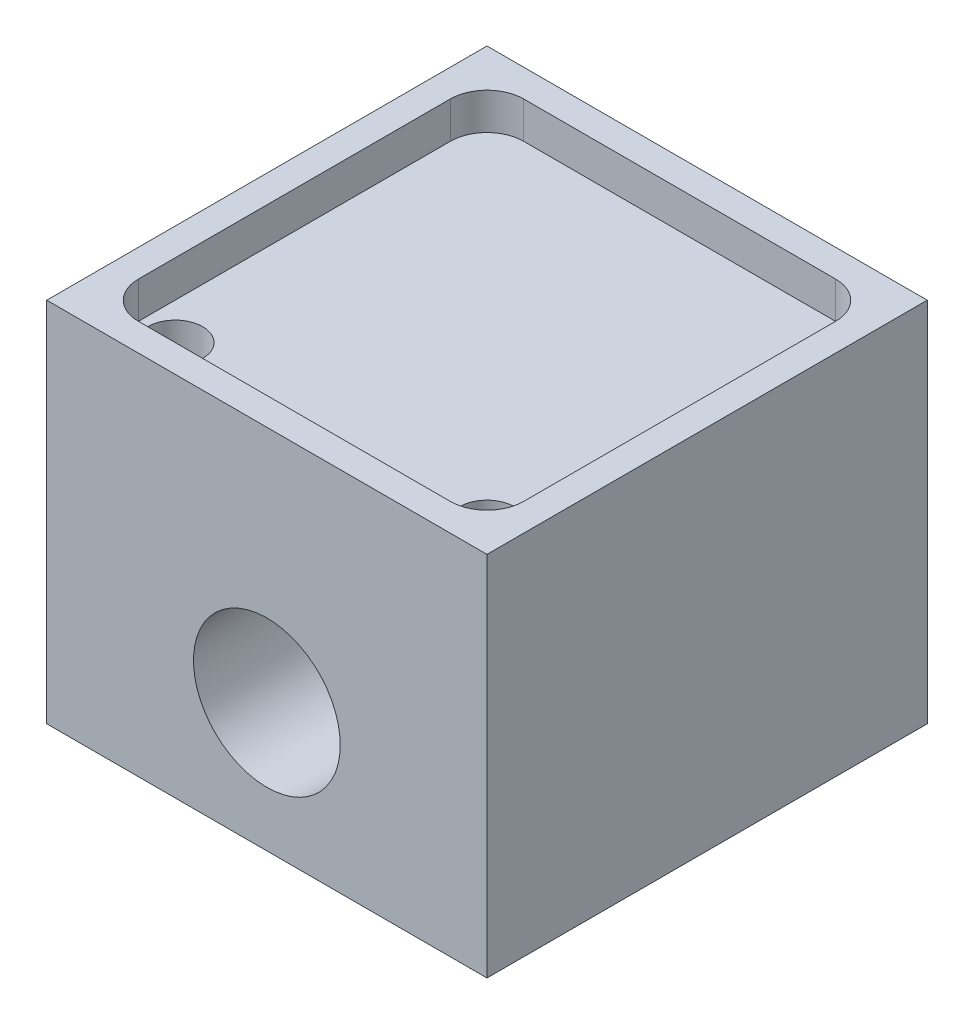
ISO-10303-21;
HEADER;
FILE_DESCRIPTION(('STEP AP214'),'2;1');
FILE_NAME('part.step','',(''),(''),'','','');
FILE_SCHEMA(('AUTOMOTIVE_DESIGN { 1 0 10303 214 1 1 1 1 }'));
ENDSEC;
DATA;
#1=APPLICATION_CONTEXT('core data for automotive mechanical design processes');
#2=APPLICATION_PROTOCOL_DEFINITION('international standard','automotive_design',2000,#1);
#3=PRODUCT_CONTEXT('',#1,'mechanical');
#4=PRODUCT('Part','Part','',(#3));
#5=PRODUCT_RELATED_PRODUCT_CATEGORY('part','',(#4));
#6=PRODUCT_DEFINITION_FORMATION('','',#4);
#7=PRODUCT_DEFINITION_CONTEXT('part definition',#1,'design');
#8=PRODUCT_DEFINITION('design','',#6,#7);
#9=PRODUCT_DEFINITION_SHAPE('','',#8);
#10=(LENGTH_UNIT() NAMED_UNIT(*) SI_UNIT(.MILLI.,.METRE.));
#11=(NAMED_UNIT(*) PLANE_ANGLE_UNIT() SI_UNIT($,.RADIAN.));
#12=(NAMED_UNIT(*) SI_UNIT($,.STERADIAN.) SOLID_ANGLE_UNIT());
#13=UNCERTAINTY_MEASURE_WITH_UNIT(LENGTH_MEASURE(1.E-05),#10,'distance_accuracy_value','');
#14=(GEOMETRIC_REPRESENTATION_CONTEXT(3) GLOBAL_UNCERTAINTY_ASSIGNED_CONTEXT((#13)) GLOBAL_UNIT_ASSIGNED_CONTEXT((#10,
#11,#12)) REPRESENTATION_CONTEXT('',''));
#15=CARTESIAN_POINT('',(0.,0.,0.));
#16=DIRECTION('',(0.,0.,1.));
#17=DIRECTION('',(1.,0.,0.));
#18=AXIS2_PLACEMENT_3D('',#15,#16,#17);
#19=CARTESIAN_POINT('',(12.,20.,-12.));
#20=DIRECTION('',(-1.,0.,0.));
#21=DIRECTION('',(0.,0.,1.));
#22=AXIS2_PLACEMENT_3D('',#19,#20,#21);
#23=PLANE('',#22);
#24=DIRECTION('',(0.,0.,-1.));
#25=VECTOR('',#24,1.);
#26=CARTESIAN_POINT('',(12.,0.,-12.));
#27=LINE('',#26,#25);
#28=CARTESIAN_POINT('',(12.,0.,12.));
#29=VERTEX_POINT('',#28);
#30=CARTESIAN_POINT('',(12.,0.,-12.));
#31=VERTEX_POINT('',#30);
#32=EDGE_CURVE('E153',#29,#31,#27,.T.);
#33=ORIENTED_EDGE('',*,*,#32,.T.);
#34=DIRECTION('',(0.,-1.,0.));
#35=VECTOR('',#34,1.);
#36=CARTESIAN_POINT('',(12.,20.,-12.));
#37=LINE('',#36,#35);
#38=CARTESIAN_POINT('',(12.,20.,-12.));
#39=VERTEX_POINT('',#38);
#40=EDGE_CURVE('E132',#39,#31,#37,.T.);
#41=ORIENTED_EDGE('',*,*,#40,.F.);
#42=DIRECTION('',(0.,0.,-1.));
#43=VECTOR('',#42,1.);
#44=CARTESIAN_POINT('',(12.,20.,-12.));
#45=LINE('',#44,#43);
#46=CARTESIAN_POINT('',(12.,20.,12.));
#47=VERTEX_POINT('',#46);
#48=EDGE_CURVE('E140',#47,#39,#45,.T.);
#49=ORIENTED_EDGE('',*,*,#48,.F.);
#50=DIRECTION('',(0.,-1.,0.));
#51=VECTOR('',#50,1.);
#52=CARTESIAN_POINT('',(12.,20.,12.));
#53=LINE('',#52,#51);
#54=EDGE_CURVE('E255',#47,#29,#53,.T.);
#55=ORIENTED_EDGE('',*,*,#54,.T.);
#56=EDGE_LOOP('',(#33,#41,#49,#55));
#57=FACE_BOUND('',#56,.T.);
#58=ADVANCED_FACE('F39',(#57),#23,.F.);
#59=CARTESIAN_POINT('',(-12.,20.,-12.));
#60=DIRECTION('',(0.,0.,1.));
#61=DIRECTION('',(1.,0.,0.));
#62=AXIS2_PLACEMENT_3D('',#59,#60,#61);
#63=PLANE('',#62);
#64=CARTESIAN_POINT('',(0.,7.,-12.));
#65=DIRECTION('',(0.,0.,1.));
#66=DIRECTION('',(1.,0.,0.));
#67=AXIS2_PLACEMENT_3D('',#64,#65,#66);
#68=CIRCLE('',#67,4.);
#69=CARTESIAN_POINT('',(4.,7.,-12.));
#70=VERTEX_POINT('',#69);
#71=EDGE_CURVE('E245',#70,#70,#68,.T.);
#72=ORIENTED_EDGE('',*,*,#71,.T.);
#73=EDGE_LOOP('',(#72));
#74=FACE_BOUND('',#73,.T.);
#75=DIRECTION('',(-1.,0.,0.));
#76=VECTOR('',#75,1.);
#77=CARTESIAN_POINT('',(-12.,0.,-12.));
#78=LINE('',#77,#76);
#79=CARTESIAN_POINT('',(-12.,0.,-12.));
#80=VERTEX_POINT('',#79);
#81=EDGE_CURVE('E235',#31,#80,#78,.T.);
#82=ORIENTED_EDGE('',*,*,#81,.T.);
#83=DIRECTION('',(0.,-1.,0.));
#84=VECTOR('',#83,1.);
#85=CARTESIAN_POINT('',(-12.,20.,-12.));
#86=LINE('',#85,#84);
#87=CARTESIAN_POINT('',(-12.,20.,-12.));
#88=VERTEX_POINT('',#87);
#89=EDGE_CURVE('E135',#88,#80,#86,.T.);
#90=ORIENTED_EDGE('',*,*,#89,.F.);
#91=DIRECTION('',(-1.,0.,0.));
#92=VECTOR('',#91,1.);
#93=CARTESIAN_POINT('',(-12.,20.,-12.));
#94=LINE('',#93,#92);
#95=EDGE_CURVE('E128',#39,#88,#94,.T.);
#96=ORIENTED_EDGE('',*,*,#95,.F.);
#97=ORIENTED_EDGE('',*,*,#40,.T.);
#98=EDGE_LOOP('',(#82,#90,#96,#97));
#99=FACE_BOUND('',#98,.T.);
#100=ADVANCED_FACE('F130',(#74,#99),#63,.F.);
#101=CARTESIAN_POINT('',(-12.,20.,-12.));
#102=DIRECTION('',(1.,0.,0.));
#103=DIRECTION('',(0.,0.,-1.));
#104=AXIS2_PLACEMENT_3D('',#101,#102,#103);
#105=PLANE('',#104);
#106=DIRECTION('',(0.,0.,1.));
#107=VECTOR('',#106,1.);
#108=CARTESIAN_POINT('',(-12.,0.,-12.));
#109=LINE('',#108,#107);
#110=CARTESIAN_POINT('',(-12.,0.,12.));
#111=VERTEX_POINT('',#110);
#112=EDGE_CURVE('E259',#80,#111,#109,.T.);
#113=ORIENTED_EDGE('',*,*,#112,.T.);
#114=DIRECTION('',(0.,-1.,0.));
#115=VECTOR('',#114,1.);
#116=CARTESIAN_POINT('',(-12.,20.,12.));
#117=LINE('',#116,#115);
#118=CARTESIAN_POINT('',(-12.,20.,12.));
#119=VERTEX_POINT('',#118);
#120=EDGE_CURVE('E161',#119,#111,#117,.T.);
#121=ORIENTED_EDGE('',*,*,#120,.F.);
#122=DIRECTION('',(0.,0.,1.));
#123=VECTOR('',#122,1.);
#124=CARTESIAN_POINT('',(-12.,20.,-12.));
#125=LINE('',#124,#123);
#126=EDGE_CURVE('E139',#88,#119,#125,.T.);
#127=ORIENTED_EDGE('',*,*,#126,.F.);
#128=ORIENTED_EDGE('',*,*,#89,.T.);
#129=EDGE_LOOP('',(#113,#121,#127,#128));
#130=FACE_BOUND('',#129,.T.);
#131=ADVANCED_FACE('F275',(#130),#105,.F.);
#132=CARTESIAN_POINT('',(-12.,20.,12.));
#133=DIRECTION('',(0.,0.,-1.));
#134=DIRECTION('',(-1.,0.,0.));
#135=AXIS2_PLACEMENT_3D('',#132,#133,#134);
#136=PLANE('',#135);
#137=CARTESIAN_POINT('',(0.,7.,12.));
#138=DIRECTION('',(0.,0.,1.));
#139=DIRECTION('',(1.,0.,0.));
#140=AXIS2_PLACEMENT_3D('',#137,#138,#139);
#141=CIRCLE('',#140,4.);
#142=CARTESIAN_POINT('',(4.,7.,12.));
#143=VERTEX_POINT('',#142);
#144=EDGE_CURVE('E324',#143,#143,#141,.T.);
#145=ORIENTED_EDGE('',*,*,#144,.F.);
#146=EDGE_LOOP('',(#145));
#147=FACE_BOUND('',#146,.T.);
#148=DIRECTION('',(1.,0.,0.));
#149=VECTOR('',#148,1.);
#150=CARTESIAN_POINT('',(-12.,0.,12.));
#151=LINE('',#150,#149);
#152=EDGE_CURVE('E150',#111,#29,#151,.T.);
#153=ORIENTED_EDGE('',*,*,#152,.T.);
#154=ORIENTED_EDGE('',*,*,#54,.F.);
#155=DIRECTION('',(1.,0.,0.));
#156=VECTOR('',#155,1.);
#157=CARTESIAN_POINT('',(-12.,20.,12.));
#158=LINE('',#157,#156);
#159=EDGE_CURVE('E145',#119,#47,#158,.T.);
#160=ORIENTED_EDGE('',*,*,#159,.F.);
#161=ORIENTED_EDGE('',*,*,#120,.T.);
#162=EDGE_LOOP('',(#153,#154,#160,#161));
#163=FACE_BOUND('',#162,.T.);
#164=ADVANCED_FACE('F270',(#147,#163),#136,.F.);
#165=CARTESIAN_POINT('',(0.,20.,0.));
#166=DIRECTION('',(0.,1.,0.));
#167=DIRECTION('',(0.,0.,1.));
#168=AXIS2_PLACEMENT_3D('',#165,#166,#167);
#169=PLANE('',#168);
#170=DIRECTION('',(0.,0.,-1.));
#171=VECTOR('',#170,1.);
#172=CARTESIAN_POINT('',(10.5,20.,-10.5));
#173=LINE('',#172,#171);
#174=CARTESIAN_POINT('',(10.5,20.,8.5));
#175=VERTEX_POINT('',#174);
#176=CARTESIAN_POINT('',(10.5,20.,-8.5));
#177=VERTEX_POINT('',#176);
#178=EDGE_CURVE('E241',#175,#177,#173,.T.);
#179=ORIENTED_EDGE('',*,*,#178,.F.);
#180=CARTESIAN_POINT('',(8.5,20.,8.5));
#181=DIRECTION('',(0.,1.,0.));
#182=DIRECTION('',(0.,0.,1.));
#183=AXIS2_PLACEMENT_3D('',#180,#181,#182);
#184=CIRCLE('',#183,2.);
#185=CARTESIAN_POINT('',(8.5,20.,10.5));
#186=VERTEX_POINT('',#185);
#187=EDGE_CURVE('E11',#175,#186,#184,.F.);
#188=ORIENTED_EDGE('',*,*,#187,.T.);
#189=DIRECTION('',(1.,0.,0.));
#190=VECTOR('',#189,1.);
#191=CARTESIAN_POINT('',(-10.5,20.,10.5));
#192=LINE('',#191,#190);
#193=CARTESIAN_POINT('',(-8.5,20.,10.5));
#194=VERTEX_POINT('',#193);
#195=EDGE_CURVE('E209',#194,#186,#192,.T.);
#196=ORIENTED_EDGE('',*,*,#195,.F.);
#197=CARTESIAN_POINT('',(-8.5,20.,8.5));
#198=DIRECTION('',(0.,1.,0.));
#199=DIRECTION('',(0.,0.,1.));
#200=AXIS2_PLACEMENT_3D('',#197,#198,#199);
#201=CIRCLE('',#200,2.);
#202=CARTESIAN_POINT('',(-10.5,20.,8.5));
#203=VERTEX_POINT('',#202);
#204=EDGE_CURVE('E48',#194,#203,#201,.F.);
#205=ORIENTED_EDGE('',*,*,#204,.T.);
#206=DIRECTION('',(0.,0.,1.));
#207=VECTOR('',#206,1.);
#208=CARTESIAN_POINT('',(-10.5,20.,-10.5));
#209=LINE('',#208,#207);
#210=CARTESIAN_POINT('',(-10.5,20.,-8.5));
#211=VERTEX_POINT('',#210);
#212=EDGE_CURVE('E208',#211,#203,#209,.T.);
#213=ORIENTED_EDGE('',*,*,#212,.F.);
#214=CARTESIAN_POINT('',(-8.5,20.,-8.5));
#215=DIRECTION('',(0.,1.,0.));
#216=DIRECTION('',(0.,0.,1.));
#217=AXIS2_PLACEMENT_3D('',#214,#215,#216);
#218=CIRCLE('',#217,2.);
#219=CARTESIAN_POINT('',(-8.5,20.,-10.5));
#220=VERTEX_POINT('',#219);
#221=EDGE_CURVE('E203',#211,#220,#218,.F.);
#222=ORIENTED_EDGE('',*,*,#221,.T.);
#223=DIRECTION('',(-1.,0.,0.));
#224=VECTOR('',#223,1.);
#225=CARTESIAN_POINT('',(-10.5,20.,-10.5));
#226=LINE('',#225,#224);
#227=CARTESIAN_POINT('',(8.49999999999999,20.,-10.5));
#228=VERTEX_POINT('',#227);
#229=EDGE_CURVE('E216',#228,#220,#226,.T.);
#230=ORIENTED_EDGE('',*,*,#229,.F.);
#231=CARTESIAN_POINT('',(8.5,20.,-8.5));
#232=DIRECTION('',(0.,1.,0.));
#233=DIRECTION('',(0.,0.,1.));
#234=AXIS2_PLACEMENT_3D('',#231,#232,#233);
#235=CIRCLE('',#234,2.);
#236=EDGE_CURVE('E200',#228,#177,#235,.F.);
#237=ORIENTED_EDGE('',*,*,#236,.T.);
#238=EDGE_LOOP('',(#179,#188,#196,#205,#213,#222,#230,#237));
#239=FACE_BOUND('',#238,.T.);
#240=ORIENTED_EDGE('',*,*,#48,.T.);
#241=ORIENTED_EDGE('',*,*,#95,.T.);
#242=ORIENTED_EDGE('',*,*,#126,.T.);
#243=ORIENTED_EDGE('',*,*,#159,.T.);
#244=EDGE_LOOP('',(#240,#241,#242,#243));
#245=FACE_BOUND('',#244,.T.);
#246=ADVANCED_FACE('F143',(#239,#245),#169,.T.);
#247=CARTESIAN_POINT('',(0.,0.,0.));
#248=DIRECTION('',(0.,1.,0.));
#249=DIRECTION('',(0.,0.,1.));
#250=AXIS2_PLACEMENT_3D('',#247,#248,#249);
#251=PLANE('',#250);
#252=CARTESIAN_POINT('',(-8.5,0.,8.5));
#253=DIRECTION('',(0.,1.,0.));
#254=DIRECTION('',(0.,0.,1.));
#255=AXIS2_PLACEMENT_3D('',#252,#253,#254);
#256=CIRCLE('',#255,1.5);
#257=CARTESIAN_POINT('',(-8.5,0.,10.));
#258=VERTEX_POINT('',#257);
#259=EDGE_CURVE('E328',#258,#258,#256,.T.);
#260=ORIENTED_EDGE('',*,*,#259,.T.);
#261=EDGE_LOOP('',(#260));
#262=FACE_BOUND('',#261,.T.);
#263=CARTESIAN_POINT('',(8.50000000000001,0.,8.49999999999999));
#264=DIRECTION('',(0.,1.,0.));
#265=DIRECTION('',(0.,0.,1.));
#266=AXIS2_PLACEMENT_3D('',#263,#264,#265);
#267=CIRCLE('',#266,1.5);
#268=CARTESIAN_POINT('',(8.50000000000001,0.,9.99999999999999));
#269=VERTEX_POINT('',#268);
#270=EDGE_CURVE('E332',#269,#269,#267,.T.);
#271=ORIENTED_EDGE('',*,*,#270,.T.);
#272=EDGE_LOOP('',(#271));
#273=FACE_BOUND('',#272,.T.);
#274=ORIENTED_EDGE('',*,*,#32,.F.);
#275=ORIENTED_EDGE('',*,*,#152,.F.);
#276=ORIENTED_EDGE('',*,*,#112,.F.);
#277=ORIENTED_EDGE('',*,*,#81,.F.);
#278=EDGE_LOOP('',(#274,#275,#276,#277));
#279=FACE_BOUND('',#278,.T.);
#280=ADVANCED_FACE('F274',(#262,#273,#279),#251,.F.);
#281=CARTESIAN_POINT('',(10.5,18.,-10.5));
#282=DIRECTION('',(1.,0.,0.));
#283=DIRECTION('',(0.,0.,-1.));
#284=AXIS2_PLACEMENT_3D('',#281,#282,#283);
#285=PLANE('',#284);
#286=ORIENTED_EDGE('',*,*,#178,.T.);
#287=DIRECTION('',(0.,1.,0.));
#288=VECTOR('',#287,1.);
#289=CARTESIAN_POINT('',(10.5,18.,-8.5));
#290=LINE('',#289,#288);
#291=CARTESIAN_POINT('',(10.5,18.,-8.5));
#292=VERTEX_POINT('',#291);
#293=EDGE_CURVE('E172',#177,#292,#290,.F.);
#294=ORIENTED_EDGE('',*,*,#293,.T.);
#295=DIRECTION('',(0.,0.,-1.));
#296=VECTOR('',#295,1.);
#297=CARTESIAN_POINT('',(10.5,18.,-10.5));
#298=LINE('',#297,#296);
#299=CARTESIAN_POINT('',(10.5,18.,8.5));
#300=VERTEX_POINT('',#299);
#301=EDGE_CURVE('E250',#300,#292,#298,.T.);
#302=ORIENTED_EDGE('',*,*,#301,.F.);
#303=DIRECTION('',(0.,1.,0.));
#304=VECTOR('',#303,1.);
#305=CARTESIAN_POINT('',(10.5,20.,8.5));
#306=LINE('',#305,#304);
#307=EDGE_CURVE('E168',#300,#175,#306,.T.);
#308=ORIENTED_EDGE('',*,*,#307,.T.);
#309=EDGE_LOOP('',(#286,#294,#302,#308));
#310=FACE_BOUND('',#309,.T.);
#311=ADVANCED_FACE('F314',(#310),#285,.F.);
#312=CARTESIAN_POINT('',(-10.5,18.,10.5));
#313=DIRECTION('',(0.,0.,1.));
#314=DIRECTION('',(1.,0.,0.));
#315=AXIS2_PLACEMENT_3D('',#312,#313,#314);
#316=PLANE('',#315);
#317=DIRECTION('',(1.,0.,0.));
#318=VECTOR('',#317,1.);
#319=CARTESIAN_POINT('',(-10.5,18.,10.5));
#320=LINE('',#319,#318);
#321=CARTESIAN_POINT('',(-8.5,18.,10.5));
#322=VERTEX_POINT('',#321);
#323=CARTESIAN_POINT('',(8.5,18.,10.5));
#324=VERTEX_POINT('',#323);
#325=EDGE_CURVE('E225',#322,#324,#320,.T.);
#326=ORIENTED_EDGE('',*,*,#325,.F.);
#327=DIRECTION('',(0.,1.,0.));
#328=VECTOR('',#327,1.);
#329=CARTESIAN_POINT('',(-8.5,20.,10.5));
#330=LINE('',#329,#328);
#331=EDGE_CURVE('E197',#322,#194,#330,.T.);
#332=ORIENTED_EDGE('',*,*,#331,.T.);
#333=ORIENTED_EDGE('',*,*,#195,.T.);
#334=DIRECTION('',(0.,1.,0.));
#335=VECTOR('',#334,1.);
#336=CARTESIAN_POINT('',(8.5,18.,10.5));
#337=LINE('',#336,#335);
#338=EDGE_CURVE('E194',#186,#324,#337,.F.);
#339=ORIENTED_EDGE('',*,*,#338,.T.);
#340=EDGE_LOOP('',(#326,#332,#333,#339));
#341=FACE_BOUND('',#340,.T.);
#342=ADVANCED_FACE('F229',(#341),#316,.F.);
#343=CARTESIAN_POINT('',(-10.5,18.,-10.5));
#344=DIRECTION('',(-1.,0.,0.));
#345=DIRECTION('',(0.,0.,1.));
#346=AXIS2_PLACEMENT_3D('',#343,#344,#345);
#347=PLANE('',#346);
#348=DIRECTION('',(0.,0.,1.));
#349=VECTOR('',#348,1.);
#350=CARTESIAN_POINT('',(-10.5,18.,-10.5));
#351=LINE('',#350,#349);
#352=CARTESIAN_POINT('',(-10.5,18.,-8.5));
#353=VERTEX_POINT('',#352);
#354=CARTESIAN_POINT('',(-10.5,18.,8.5));
#355=VERTEX_POINT('',#354);
#356=EDGE_CURVE('E227',#353,#355,#351,.T.);
#357=ORIENTED_EDGE('',*,*,#356,.F.);
#358=DIRECTION('',(0.,1.,0.));
#359=VECTOR('',#358,1.);
#360=CARTESIAN_POINT('',(-10.5,20.,-8.5));
#361=LINE('',#360,#359);
#362=EDGE_CURVE('E190',#353,#211,#361,.T.);
#363=ORIENTED_EDGE('',*,*,#362,.T.);
#364=ORIENTED_EDGE('',*,*,#212,.T.);
#365=DIRECTION('',(0.,1.,0.));
#366=VECTOR('',#365,1.);
#367=CARTESIAN_POINT('',(-10.5,18.,8.5));
#368=LINE('',#367,#366);
#369=EDGE_CURVE('E187',#203,#355,#368,.F.);
#370=ORIENTED_EDGE('',*,*,#369,.T.);
#371=EDGE_LOOP('',(#357,#363,#364,#370));
#372=FACE_BOUND('',#371,.T.);
#373=ADVANCED_FACE('F212',(#372),#347,.F.);
#374=CARTESIAN_POINT('',(-10.5,18.,-10.5));
#375=DIRECTION('',(0.,0.,-1.));
#376=DIRECTION('',(-1.,0.,0.));
#377=AXIS2_PLACEMENT_3D('',#374,#375,#376);
#378=PLANE('',#377);
#379=DIRECTION('',(-1.,0.,0.));
#380=VECTOR('',#379,1.);
#381=CARTESIAN_POINT('',(-10.5,18.,-10.5));
#382=LINE('',#381,#380);
#383=CARTESIAN_POINT('',(8.49999999999999,18.,-10.5));
#384=VERTEX_POINT('',#383);
#385=CARTESIAN_POINT('',(-8.5,18.,-10.5));
#386=VERTEX_POINT('',#385);
#387=EDGE_CURVE('E237',#384,#386,#382,.T.);
#388=ORIENTED_EDGE('',*,*,#387,.F.);
#389=DIRECTION('',(0.,1.,0.));
#390=VECTOR('',#389,1.);
#391=CARTESIAN_POINT('',(8.5,20.,-10.5));
#392=LINE('',#391,#390);
#393=EDGE_CURVE('E159',#384,#228,#392,.T.);
#394=ORIENTED_EDGE('',*,*,#393,.T.);
#395=ORIENTED_EDGE('',*,*,#229,.T.);
#396=DIRECTION('',(0.,1.,0.));
#397=VECTOR('',#396,1.);
#398=CARTESIAN_POINT('',(-8.5,18.,-10.5));
#399=LINE('',#398,#397);
#400=EDGE_CURVE('E155',#220,#386,#399,.F.);
#401=ORIENTED_EDGE('',*,*,#400,.T.);
#402=EDGE_LOOP('',(#388,#394,#395,#401));
#403=FACE_BOUND('',#402,.T.);
#404=ADVANCED_FACE('F350',(#403),#378,.F.);
#405=CARTESIAN_POINT('',(0.,18.,0.));
#406=DIRECTION('',(0.,1.,0.));
#407=DIRECTION('',(0.,0.,1.));
#408=AXIS2_PLACEMENT_3D('',#405,#406,#407);
#409=PLANE('',#408);
#410=CARTESIAN_POINT('',(-8.5,18.,8.5));
#411=DIRECTION('',(0.,1.,0.));
#412=DIRECTION('',(0.,0.,1.));
#413=AXIS2_PLACEMENT_3D('',#410,#411,#412);
#414=CIRCLE('',#413,1.5);
#415=CARTESIAN_POINT('',(-8.5,18.,10.));
#416=VERTEX_POINT('',#415);
#417=EDGE_CURVE('E336',#416,#416,#414,.T.);
#418=ORIENTED_EDGE('',*,*,#417,.F.);
#419=EDGE_LOOP('',(#418));
#420=FACE_BOUND('',#419,.T.);
#421=CARTESIAN_POINT('',(8.50000000000001,18.,8.49999999999999));
#422=DIRECTION('',(0.,1.,0.));
#423=DIRECTION('',(0.,0.,-1.));
#424=AXIS2_PLACEMENT_3D('',#421,#422,#423);
#425=CIRCLE('',#424,1.5);
#426=CARTESIAN_POINT('',(8.50000000000001,18.,9.99999999999999));
#427=VERTEX_POINT('',#426);
#428=EDGE_CURVE('E337',#427,#427,#425,.T.);
#429=ORIENTED_EDGE('',*,*,#428,.F.);
#430=EDGE_LOOP('',(#429));
#431=FACE_BOUND('',#430,.T.);
#432=ORIENTED_EDGE('',*,*,#301,.T.);
#433=CARTESIAN_POINT('',(8.5,18.,-8.5));
#434=DIRECTION('',(0.,1.,0.));
#435=DIRECTION('',(0.,0.,1.));
#436=AXIS2_PLACEMENT_3D('',#433,#434,#435);
#437=CIRCLE('',#436,2.);
#438=EDGE_CURVE('E184',#292,#384,#437,.T.);
#439=ORIENTED_EDGE('',*,*,#438,.T.);
#440=ORIENTED_EDGE('',*,*,#387,.T.);
#441=CARTESIAN_POINT('',(-8.5,18.,-8.5));
#442=DIRECTION('',(0.,1.,0.));
#443=DIRECTION('',(0.,0.,1.));
#444=AXIS2_PLACEMENT_3D('',#441,#442,#443);
#445=CIRCLE('',#444,2.);
#446=EDGE_CURVE('E181',#386,#353,#445,.T.);
#447=ORIENTED_EDGE('',*,*,#446,.T.);
#448=ORIENTED_EDGE('',*,*,#356,.T.);
#449=CARTESIAN_POINT('',(-8.5,18.,8.5));
#450=DIRECTION('',(0.,1.,0.));
#451=DIRECTION('',(0.,0.,1.));
#452=AXIS2_PLACEMENT_3D('',#449,#450,#451);
#453=CIRCLE('',#452,2.);
#454=EDGE_CURVE('E178',#355,#322,#453,.T.);
#455=ORIENTED_EDGE('',*,*,#454,.T.);
#456=ORIENTED_EDGE('',*,*,#325,.T.);
#457=CARTESIAN_POINT('',(8.5,18.,8.5));
#458=DIRECTION('',(0.,1.,0.));
#459=DIRECTION('',(0.,0.,1.));
#460=AXIS2_PLACEMENT_3D('',#457,#458,#459);
#461=CIRCLE('',#460,2.);
#462=EDGE_CURVE('E175',#324,#300,#461,.T.);
#463=ORIENTED_EDGE('',*,*,#462,.T.);
#464=EDGE_LOOP('',(#432,#439,#440,#447,#448,#455,#456,#463));
#465=FACE_BOUND('',#464,.T.);
#466=ADVANCED_FACE('F224',(#420,#431,#465),#409,.T.);
#467=CARTESIAN_POINT('',(8.5,18.,-8.5));
#468=DIRECTION('',(0.,-1.,0.));
#469=DIRECTION('',(0.,0.,-1.));
#470=AXIS2_PLACEMENT_3D('',#467,#468,#469);
#471=CYLINDRICAL_SURFACE('',#470,2.);
#472=ORIENTED_EDGE('',*,*,#438,.F.);
#473=ORIENTED_EDGE('',*,*,#293,.F.);
#474=ORIENTED_EDGE('',*,*,#236,.F.);
#475=ORIENTED_EDGE('',*,*,#393,.F.);
#476=EDGE_LOOP('',(#472,#473,#474,#475));
#477=FACE_BOUND('',#476,.T.);
#478=ADVANCED_FACE('F291',(#477),#471,.F.);
#479=CARTESIAN_POINT('',(-8.5,18.,-8.5));
#480=DIRECTION('',(0.,-1.,0.));
#481=DIRECTION('',(0.,0.,-1.));
#482=AXIS2_PLACEMENT_3D('',#479,#480,#481);
#483=CYLINDRICAL_SURFACE('',#482,2.);
#484=ORIENTED_EDGE('',*,*,#446,.F.);
#485=ORIENTED_EDGE('',*,*,#400,.F.);
#486=ORIENTED_EDGE('',*,*,#221,.F.);
#487=ORIENTED_EDGE('',*,*,#362,.F.);
#488=EDGE_LOOP('',(#484,#485,#486,#487));
#489=FACE_BOUND('',#488,.T.);
#490=ADVANCED_FACE('F294',(#489),#483,.F.);
#491=CARTESIAN_POINT('',(-8.5,18.,8.5));
#492=DIRECTION('',(0.,-1.,0.));
#493=DIRECTION('',(0.,0.,-1.));
#494=AXIS2_PLACEMENT_3D('',#491,#492,#493);
#495=CYLINDRICAL_SURFACE('',#494,2.);
#496=ORIENTED_EDGE('',*,*,#454,.F.);
#497=ORIENTED_EDGE('',*,*,#369,.F.);
#498=ORIENTED_EDGE('',*,*,#204,.F.);
#499=ORIENTED_EDGE('',*,*,#331,.F.);
#500=EDGE_LOOP('',(#496,#497,#498,#499));
#501=FACE_BOUND('',#500,.T.);
#502=ADVANCED_FACE('F219',(#501),#495,.F.);
#503=CARTESIAN_POINT('',(8.5,18.,8.5));
#504=DIRECTION('',(0.,-1.,0.));
#505=DIRECTION('',(0.,0.,-1.));
#506=AXIS2_PLACEMENT_3D('',#503,#504,#505);
#507=CYLINDRICAL_SURFACE('',#506,2.);
#508=ORIENTED_EDGE('',*,*,#462,.F.);
#509=ORIENTED_EDGE('',*,*,#338,.F.);
#510=ORIENTED_EDGE('',*,*,#187,.F.);
#511=ORIENTED_EDGE('',*,*,#307,.F.);
#512=EDGE_LOOP('',(#508,#509,#510,#511));
#513=FACE_BOUND('',#512,.T.);
#514=ADVANCED_FACE('F41',(#513),#507,.F.);
#515=CARTESIAN_POINT('',(0.,7.,-30.));
#516=DIRECTION('',(0.,0.,1.));
#517=DIRECTION('',(1.,0.,0.));
#518=AXIS2_PLACEMENT_3D('',#515,#516,#517);
#519=CYLINDRICAL_SURFACE('',#518,4.);
#520=CARTESIAN_POINT('',(4.,7.,12.));
#521=CARTESIAN_POINT('',(4.,7.,11.75));
#522=CARTESIAN_POINT('',(4.,7.,11.5));
#523=CARTESIAN_POINT('',(4.,7.,11.));
#524=CARTESIAN_POINT('',(4.,7.,10.75));
#525=CARTESIAN_POINT('',(4.,7.,10.25));
#526=CARTESIAN_POINT('',(4.,7.,10.));
#527=CARTESIAN_POINT('',(4.,7.,9.5));
#528=CARTESIAN_POINT('',(4.,7.,9.25));
#529=CARTESIAN_POINT('',(4.,7.,8.75));
#530=CARTESIAN_POINT('',(4.,7.,8.5));
#531=CARTESIAN_POINT('',(4.,7.,8.));
#532=CARTESIAN_POINT('',(4.,7.,7.75));
#533=CARTESIAN_POINT('',(4.,7.,7.25));
#534=CARTESIAN_POINT('',(4.,7.,7.));
#535=CARTESIAN_POINT('',(4.,7.,6.5));
#536=CARTESIAN_POINT('',(4.,7.,6.25));
#537=CARTESIAN_POINT('',(4.,7.,5.75));
#538=CARTESIAN_POINT('',(4.,7.,5.5));
#539=CARTESIAN_POINT('',(4.,7.,5.));
#540=CARTESIAN_POINT('',(4.,7.,4.75));
#541=CARTESIAN_POINT('',(4.,7.,4.25));
#542=CARTESIAN_POINT('',(4.,7.,4.));
#543=CARTESIAN_POINT('',(4.,7.,3.5));
#544=CARTESIAN_POINT('',(4.,7.,3.25));
#545=CARTESIAN_POINT('',(4.,7.,2.75));
#546=CARTESIAN_POINT('',(4.,7.,2.5));
#547=CARTESIAN_POINT('',(4.,7.,2.));
#548=CARTESIAN_POINT('',(4.,7.,1.75));
#549=CARTESIAN_POINT('',(4.,7.,1.25));
#550=CARTESIAN_POINT('',(4.,7.,1.));
#551=CARTESIAN_POINT('',(4.,7.,0.500000000000004));
#552=CARTESIAN_POINT('',(4.,7.,0.250000000000004));
#553=CARTESIAN_POINT('',(4.,7.,-0.249999999999997));
#554=CARTESIAN_POINT('',(4.,7.,-0.499999999999997));
#555=CARTESIAN_POINT('',(4.,7.,-0.999999999999997));
#556=CARTESIAN_POINT('',(4.,7.,-1.25));
#557=CARTESIAN_POINT('',(4.,7.,-1.75));
#558=CARTESIAN_POINT('',(4.,7.,-2.));
#559=CARTESIAN_POINT('',(4.,7.,-2.5));
#560=CARTESIAN_POINT('',(4.,7.,-2.75));
#561=CARTESIAN_POINT('',(4.,7.,-3.25));
#562=CARTESIAN_POINT('',(4.,7.,-3.5));
#563=CARTESIAN_POINT('',(4.,7.,-4.));
#564=CARTESIAN_POINT('',(4.,7.,-4.25));
#565=CARTESIAN_POINT('',(4.,7.,-4.75));
#566=CARTESIAN_POINT('',(4.,7.,-5.));
#567=CARTESIAN_POINT('',(4.,7.,-5.5));
#568=CARTESIAN_POINT('',(4.,7.,-5.75));
#569=CARTESIAN_POINT('',(4.,7.,-6.25));
#570=CARTESIAN_POINT('',(4.,7.,-6.5));
#571=CARTESIAN_POINT('',(4.,7.,-7.));
#572=CARTESIAN_POINT('',(4.,7.,-7.25));
#573=CARTESIAN_POINT('',(4.,7.,-7.75));
#574=CARTESIAN_POINT('',(4.,7.,-8.));
#575=CARTESIAN_POINT('',(4.,7.,-8.5));
#576=CARTESIAN_POINT('',(4.,7.,-8.75));
#577=CARTESIAN_POINT('',(4.,7.,-9.25));
#578=CARTESIAN_POINT('',(4.,7.,-9.5));
#579=CARTESIAN_POINT('',(4.,7.,-10.));
#580=CARTESIAN_POINT('',(4.,7.,-10.25));
#581=CARTESIAN_POINT('',(4.,7.,-10.75));
#582=CARTESIAN_POINT('',(4.,7.,-11.));
#583=CARTESIAN_POINT('',(4.,7.,-11.5));
#584=CARTESIAN_POINT('',(4.,7.,-11.75));
#585=CARTESIAN_POINT('',(4.,7.,-12.));
#586=B_SPLINE_CURVE_WITH_KNOTS('',3,(#520,#521,#522,#523,#524,#525,#526,#527,#528,#529,#530,
#531,#532,#533,#534,#535,#536,#537,#538,#539,#540,#541,#542,#543,#544,#545,#546,#547,#548,#549,
#550,#551,#552,#553,#554,#555,#556,#557,#558,#559,#560,#561,#562,#563,#564,#565,#566,#567,#568,
#569,#570,#571,#572,#573,#574,#575,#576,#577,#578,#579,#580,#581,#582,#583,#584,#585),
.UNSPECIFIED.,.F.,.F.,(4,2,2,2,2,2,2,2,2,2,2,2,2,2,2,2,2,2,2,2,2,2,2,2,2,2,2,2,2,2,2,2,4),(0.,
0.750000000000001,1.5,2.25,3.,3.75,4.5,5.25,6.00000000000001,6.75000000000001,7.5,8.25,9.,9.75,
10.5,11.25,12.,12.75,13.5,14.25,15.,15.75,16.5,17.25,18.,18.75,19.5,20.25,21.,21.75,22.5,23.25,
24.),.UNSPECIFIED.);
#587=EDGE_CURVE('BSEAM302',#143,#70,#586,.T.);
#588=ORIENTED_EDGE('',*,*,#144,.T.);
#589=ORIENTED_EDGE('',*,*,#71,.F.);
#590=ORIENTED_EDGE('',*,*,#587,.T.);
#591=ORIENTED_EDGE('',*,*,#587,.F.);
#592=EDGE_LOOP('',(#588,#590,#589,#591));
#593=FACE_BOUND('',#592,.T.);
#594=ADVANCED_FACE('F302',(#593),#519,.F.);
#595=CARTESIAN_POINT('',(8.50000000000001,-24.,8.49999999999999));
#596=DIRECTION('',(0.,1.,0.));
#597=DIRECTION('',(0.,0.,1.));
#598=AXIS2_PLACEMENT_3D('',#595,#596,#597);
#599=CYLINDRICAL_SURFACE('',#598,1.5);
#600=CARTESIAN_POINT('',(8.50000000000001,18.,9.99999999999999));
#601=CARTESIAN_POINT('',(8.50000000000001,17.8125,9.99999999999999));
#602=CARTESIAN_POINT('',(8.50000000000001,17.625,9.99999999999999));
#603=CARTESIAN_POINT('',(8.50000000000001,17.25,9.99999999999999));
#604=CARTESIAN_POINT('',(8.50000000000001,17.0625,9.99999999999999));
#605=CARTESIAN_POINT('',(8.50000000000001,16.6875,9.99999999999999));
#606=CARTESIAN_POINT('',(8.50000000000001,16.5,9.99999999999999));
#607=CARTESIAN_POINT('',(8.50000000000001,16.125,9.99999999999999));
#608=CARTESIAN_POINT('',(8.50000000000001,15.9375,9.99999999999999));
#609=CARTESIAN_POINT('',(8.50000000000001,15.5625,9.99999999999999));
#610=CARTESIAN_POINT('',(8.50000000000001,15.375,9.99999999999999));
#611=CARTESIAN_POINT('',(8.50000000000001,15.,9.99999999999999));
#612=CARTESIAN_POINT('',(8.50000000000001,14.8125,9.99999999999999));
#613=CARTESIAN_POINT('',(8.50000000000001,14.4375,9.99999999999999));
#614=CARTESIAN_POINT('',(8.50000000000001,14.25,9.99999999999999));
#615=CARTESIAN_POINT('',(8.50000000000001,13.875,9.99999999999999));
#616=CARTESIAN_POINT('',(8.50000000000001,13.6875,9.99999999999999));
#617=CARTESIAN_POINT('',(8.50000000000001,13.3125,9.99999999999999));
#618=CARTESIAN_POINT('',(8.50000000000001,13.125,9.99999999999999));
#619=CARTESIAN_POINT('',(8.50000000000001,12.75,9.99999999999999));
#620=CARTESIAN_POINT('',(8.50000000000001,12.5625,9.99999999999999));
#621=CARTESIAN_POINT('',(8.50000000000001,12.1875,9.99999999999999));
#622=CARTESIAN_POINT('',(8.50000000000001,12.,9.99999999999999));
#623=CARTESIAN_POINT('',(8.50000000000001,11.625,9.99999999999999));
#624=CARTESIAN_POINT('',(8.50000000000001,11.4375,9.99999999999999));
#625=CARTESIAN_POINT('',(8.50000000000001,11.0625,9.99999999999999));
#626=CARTESIAN_POINT('',(8.50000000000001,10.875,9.99999999999999));
#627=CARTESIAN_POINT('',(8.50000000000001,10.5,9.99999999999999));
#628=CARTESIAN_POINT('',(8.50000000000001,10.3125,9.99999999999999));
#629=CARTESIAN_POINT('',(8.50000000000001,9.9375,9.99999999999999));
#630=CARTESIAN_POINT('',(8.50000000000001,9.75,9.99999999999999));
#631=CARTESIAN_POINT('',(8.50000000000001,9.375,9.99999999999999));
#632=CARTESIAN_POINT('',(8.50000000000001,9.1875,9.99999999999999));
#633=CARTESIAN_POINT('',(8.50000000000001,8.8125,9.99999999999999));
#634=CARTESIAN_POINT('',(8.50000000000001,8.625,9.99999999999999));
#635=CARTESIAN_POINT('',(8.50000000000001,8.25,9.99999999999999));
#636=CARTESIAN_POINT('',(8.50000000000001,8.06249999999999,9.99999999999999));
#637=CARTESIAN_POINT('',(8.50000000000001,7.6875,9.99999999999999));
#638=CARTESIAN_POINT('',(8.50000000000001,7.5,9.99999999999999));
#639=CARTESIAN_POINT('',(8.50000000000001,7.125,9.99999999999999));
#640=CARTESIAN_POINT('',(8.50000000000001,6.9375,9.99999999999999));
#641=CARTESIAN_POINT('',(8.50000000000001,6.5625,9.99999999999999));
#642=CARTESIAN_POINT('',(8.50000000000001,6.375,9.99999999999999));
#643=CARTESIAN_POINT('',(8.50000000000001,6.,9.99999999999999));
#644=CARTESIAN_POINT('',(8.50000000000001,5.8125,9.99999999999999));
#645=CARTESIAN_POINT('',(8.50000000000001,5.4375,9.99999999999999));
#646=CARTESIAN_POINT('',(8.50000000000001,5.25,9.99999999999999));
#647=CARTESIAN_POINT('',(8.50000000000001,4.875,9.99999999999999));
#648=CARTESIAN_POINT('',(8.50000000000001,4.6875,9.99999999999999));
#649=CARTESIAN_POINT('',(8.50000000000001,4.3125,9.99999999999999));
#650=CARTESIAN_POINT('',(8.50000000000001,4.125,9.99999999999999));
#651=CARTESIAN_POINT('',(8.50000000000001,3.75,9.99999999999999));
#652=CARTESIAN_POINT('',(8.50000000000001,3.5625,9.99999999999999));
#653=CARTESIAN_POINT('',(8.50000000000001,3.1875,9.99999999999999));
#654=CARTESIAN_POINT('',(8.50000000000001,3.,9.99999999999999));
#655=CARTESIAN_POINT('',(8.50000000000001,2.625,9.99999999999999));
#656=CARTESIAN_POINT('',(8.50000000000001,2.4375,9.99999999999999));
#657=CARTESIAN_POINT('',(8.50000000000001,2.0625,9.99999999999999));
#658=CARTESIAN_POINT('',(8.50000000000001,1.875,9.99999999999999));
#659=CARTESIAN_POINT('',(8.50000000000001,1.5,9.99999999999999));
#660=CARTESIAN_POINT('',(8.50000000000001,1.3125,9.99999999999999));
#661=CARTESIAN_POINT('',(8.50000000000001,0.937499999999997,9.99999999999999));
#662=CARTESIAN_POINT('',(8.50000000000001,0.749999999999997,9.99999999999999));
#663=CARTESIAN_POINT('',(8.50000000000001,0.374999999999997,9.99999999999999));
#664=CARTESIAN_POINT('',(8.50000000000001,0.187499999999997,9.99999999999999));
#665=CARTESIAN_POINT('',(8.50000000000001,0.,9.99999999999999));
#666=B_SPLINE_CURVE_WITH_KNOTS('',3,(#600,#601,#602,#603,#604,#605,#606,#607,#608,#609,#610,
#611,#612,#613,#614,#615,#616,#617,#618,#619,#620,#621,#622,#623,#624,#625,#626,#627,#628,#629,
#630,#631,#632,#633,#634,#635,#636,#637,#638,#639,#640,#641,#642,#643,#644,#645,#646,#647,#648,
#649,#650,#651,#652,#653,#654,#655,#656,#657,#658,#659,#660,#661,#662,#663,#664,#665),
.UNSPECIFIED.,.F.,.F.,(4,2,2,2,2,2,2,2,2,2,2,2,2,2,2,2,2,2,2,2,2,2,2,2,2,2,2,2,2,2,2,2,4),(0.,
0.5625,1.125,1.6875,2.25,2.8125,3.375,3.9375,4.5,5.0625,5.62500000000001,6.18750000000001,
6.75000000000001,7.31250000000001,7.87500000000001,8.4375,9.00000000000001,9.5625,10.125,
10.6875,11.25,11.8125,12.375,12.9375,13.5,14.0625,14.625,15.1875,15.75,16.3125,16.875,17.4375,
18.),.UNSPECIFIED.);
#667=EDGE_CURVE('BSEAM307',#427,#269,#666,.T.);
#668=ORIENTED_EDGE('',*,*,#428,.T.);
#669=ORIENTED_EDGE('',*,*,#270,.F.);
#670=ORIENTED_EDGE('',*,*,#667,.T.);
#671=ORIENTED_EDGE('',*,*,#667,.F.);
#672=EDGE_LOOP('',(#668,#670,#669,#671));
#673=FACE_BOUND('',#672,.T.);
#674=ADVANCED_FACE('F307',(#673),#599,.F.);
#675=CARTESIAN_POINT('',(-8.5,-24.,8.5));
#676=DIRECTION('',(0.,1.,0.));
#677=DIRECTION('',(0.,0.,1.));
#678=AXIS2_PLACEMENT_3D('',#675,#676,#677);
#679=CYLINDRICAL_SURFACE('',#678,1.5);
#680=CARTESIAN_POINT('',(-8.5,18.,10.));
#681=CARTESIAN_POINT('',(-8.5,17.8125,10.));
#682=CARTESIAN_POINT('',(-8.5,17.625,10.));
#683=CARTESIAN_POINT('',(-8.5,17.25,10.));
#684=CARTESIAN_POINT('',(-8.5,17.0625,10.));
#685=CARTESIAN_POINT('',(-8.5,16.6875,10.));
#686=CARTESIAN_POINT('',(-8.5,16.5,10.));
#687=CARTESIAN_POINT('',(-8.5,16.125,10.));
#688=CARTESIAN_POINT('',(-8.5,15.9375,10.));
#689=CARTESIAN_POINT('',(-8.5,15.5625,10.));
#690=CARTESIAN_POINT('',(-8.5,15.375,10.));
#691=CARTESIAN_POINT('',(-8.5,15.,10.));
#692=CARTESIAN_POINT('',(-8.5,14.8125,10.));
#693=CARTESIAN_POINT('',(-8.5,14.4375,10.));
#694=CARTESIAN_POINT('',(-8.5,14.25,10.));
#695=CARTESIAN_POINT('',(-8.5,13.875,10.));
#696=CARTESIAN_POINT('',(-8.5,13.6875,10.));
#697=CARTESIAN_POINT('',(-8.5,13.3125,10.));
#698=CARTESIAN_POINT('',(-8.5,13.125,10.));
#699=CARTESIAN_POINT('',(-8.5,12.75,10.));
#700=CARTESIAN_POINT('',(-8.5,12.5625,10.));
#701=CARTESIAN_POINT('',(-8.5,12.1875,10.));
#702=CARTESIAN_POINT('',(-8.5,12.,10.));
#703=CARTESIAN_POINT('',(-8.5,11.625,10.));
#704=CARTESIAN_POINT('',(-8.5,11.4375,10.));
#705=CARTESIAN_POINT('',(-8.5,11.0625,10.));
#706=CARTESIAN_POINT('',(-8.5,10.875,10.));
#707=CARTESIAN_POINT('',(-8.5,10.5,10.));
#708=CARTESIAN_POINT('',(-8.5,10.3125,10.));
#709=CARTESIAN_POINT('',(-8.5,9.9375,10.));
#710=CARTESIAN_POINT('',(-8.5,9.75,10.));
#711=CARTESIAN_POINT('',(-8.5,9.375,10.));
#712=CARTESIAN_POINT('',(-8.5,9.1875,10.));
#713=CARTESIAN_POINT('',(-8.5,8.8125,10.));
#714=CARTESIAN_POINT('',(-8.5,8.625,10.));
#715=CARTESIAN_POINT('',(-8.5,8.25,10.));
#716=CARTESIAN_POINT('',(-8.5,8.06249999999999,10.));
#717=CARTESIAN_POINT('',(-8.5,7.6875,10.));
#718=CARTESIAN_POINT('',(-8.5,7.5,10.));
#719=CARTESIAN_POINT('',(-8.5,7.125,10.));
#720=CARTESIAN_POINT('',(-8.5,6.9375,10.));
#721=CARTESIAN_POINT('',(-8.5,6.5625,10.));
#722=CARTESIAN_POINT('',(-8.5,6.375,10.));
#723=CARTESIAN_POINT('',(-8.5,6.,10.));
#724=CARTESIAN_POINT('',(-8.5,5.8125,10.));
#725=CARTESIAN_POINT('',(-8.5,5.4375,10.));
#726=CARTESIAN_POINT('',(-8.5,5.25,10.));
#727=CARTESIAN_POINT('',(-8.5,4.875,10.));
#728=CARTESIAN_POINT('',(-8.5,4.6875,10.));
#729=CARTESIAN_POINT('',(-8.5,4.3125,10.));
#730=CARTESIAN_POINT('',(-8.5,4.125,10.));
#731=CARTESIAN_POINT('',(-8.5,3.75,10.));
#732=CARTESIAN_POINT('',(-8.5,3.5625,10.));
#733=CARTESIAN_POINT('',(-8.5,3.1875,10.));
#734=CARTESIAN_POINT('',(-8.5,3.,10.));
#735=CARTESIAN_POINT('',(-8.5,2.625,10.));
#736=CARTESIAN_POINT('',(-8.5,2.4375,10.));
#737=CARTESIAN_POINT('',(-8.5,2.0625,10.));
#738=CARTESIAN_POINT('',(-8.5,1.875,10.));
#739=CARTESIAN_POINT('',(-8.5,1.5,10.));
#740=CARTESIAN_POINT('',(-8.5,1.3125,10.));
#741=CARTESIAN_POINT('',(-8.5,0.937499999999997,10.));
#742=CARTESIAN_POINT('',(-8.5,0.749999999999997,10.));
#743=CARTESIAN_POINT('',(-8.5,0.374999999999997,10.));
#744=CARTESIAN_POINT('',(-8.5,0.187499999999997,10.));
#745=CARTESIAN_POINT('',(-8.5,0.,10.));
#746=B_SPLINE_CURVE_WITH_KNOTS('',3,(#680,#681,#682,#683,#684,#685,#686,#687,#688,#689,#690,
#691,#692,#693,#694,#695,#696,#697,#698,#699,#700,#701,#702,#703,#704,#705,#706,#707,#708,#709,
#710,#711,#712,#713,#714,#715,#716,#717,#718,#719,#720,#721,#722,#723,#724,#725,#726,#727,#728,
#729,#730,#731,#732,#733,#734,#735,#736,#737,#738,#739,#740,#741,#742,#743,#744,#745),
.UNSPECIFIED.,.F.,.F.,(4,2,2,2,2,2,2,2,2,2,2,2,2,2,2,2,2,2,2,2,2,2,2,2,2,2,2,2,2,2,2,2,4),(0.,
0.5625,1.125,1.6875,2.25,2.8125,3.375,3.9375,4.5,5.0625,5.62500000000001,6.18750000000001,
6.75000000000001,7.31250000000001,7.87500000000001,8.4375,9.00000000000001,9.5625,10.125,
10.6875,11.25,11.8125,12.375,12.9375,13.5,14.0625,14.625,15.1875,15.75,16.3125,16.875,17.4375,
18.),.UNSPECIFIED.);
#747=EDGE_CURVE('BSEAM345',#416,#258,#746,.T.);
#748=ORIENTED_EDGE('',*,*,#417,.T.);
#749=ORIENTED_EDGE('',*,*,#259,.F.);
#750=ORIENTED_EDGE('',*,*,#747,.T.);
#751=ORIENTED_EDGE('',*,*,#747,.F.);
#752=EDGE_LOOP('',(#748,#750,#749,#751));
#753=FACE_BOUND('',#752,.T.);
#754=ADVANCED_FACE('F345',(#753),#679,.F.);
#755=CLOSED_SHELL('',(#58,#100,#131,#164,#246,#280,#311,#342,#373,#404,#466,#478,#490,#502,#514,
#594,#674,#754));
#756=MANIFOLD_SOLID_BREP('B2',#755);
#757=ADVANCED_BREP_SHAPE_REPRESENTATION('',(#18,#756),#14);
#758=SHAPE_DEFINITION_REPRESENTATION(#9,#757);
ENDSEC;
END-ISO-10303-21;
